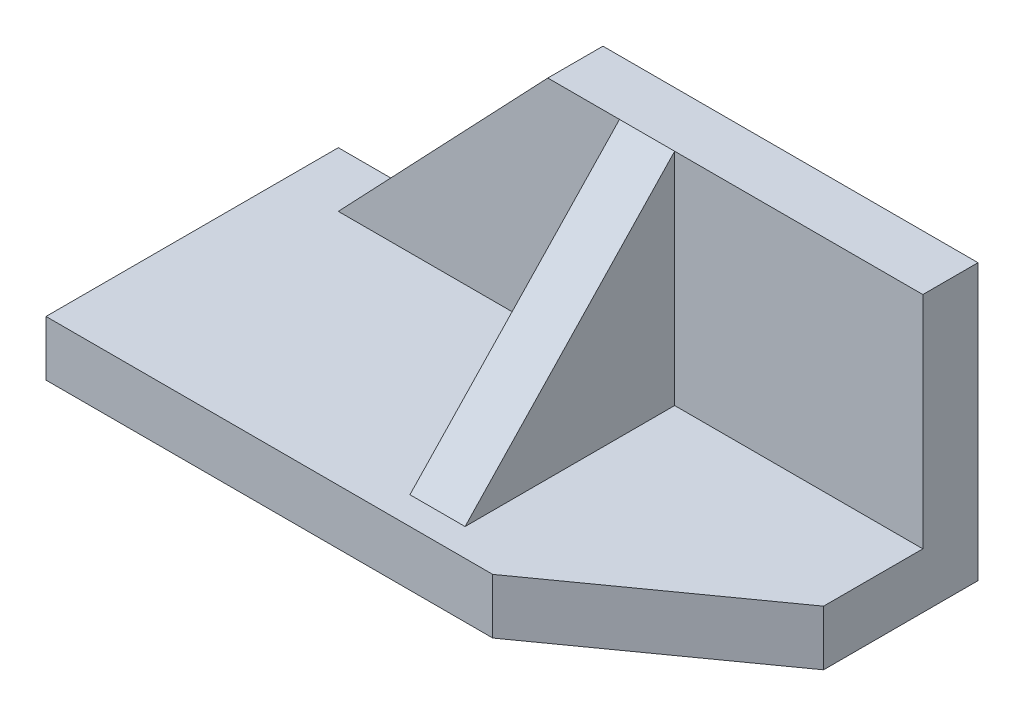
ISO-10303-21;
HEADER;
FILE_DESCRIPTION(('STEP AP214'),'2;1');
FILE_NAME('part.step','',(''),(''),'','','');
FILE_SCHEMA(('AUTOMOTIVE_DESIGN { 1 0 10303 214 1 1 1 1 }'));
ENDSEC;
DATA;
#1=APPLICATION_CONTEXT('core data for automotive mechanical design processes');
#2=APPLICATION_PROTOCOL_DEFINITION('international standard','automotive_design',2000,#1);
#3=PRODUCT_CONTEXT('',#1,'mechanical');
#4=PRODUCT('Part','Part','',(#3));
#5=PRODUCT_RELATED_PRODUCT_CATEGORY('part','',(#4));
#6=PRODUCT_DEFINITION_FORMATION('','',#4);
#7=PRODUCT_DEFINITION_CONTEXT('part definition',#1,'design');
#8=PRODUCT_DEFINITION('design','',#6,#7);
#9=PRODUCT_DEFINITION_SHAPE('','',#8);
#10=(LENGTH_UNIT() NAMED_UNIT(*) SI_UNIT(.MILLI.,.METRE.));
#11=(NAMED_UNIT(*) PLANE_ANGLE_UNIT() SI_UNIT($,.RADIAN.));
#12=(NAMED_UNIT(*) SI_UNIT($,.STERADIAN.) SOLID_ANGLE_UNIT());
#13=UNCERTAINTY_MEASURE_WITH_UNIT(LENGTH_MEASURE(1.E-05),#10,'distance_accuracy_value','');
#14=(GEOMETRIC_REPRESENTATION_CONTEXT(3) GLOBAL_UNCERTAINTY_ASSIGNED_CONTEXT((#13)) GLOBAL_UNIT_ASSIGNED_CONTEXT((#10,
#11,#12)) REPRESENTATION_CONTEXT('',''));
#15=CARTESIAN_POINT('',(0.,0.,0.));
#16=DIRECTION('',(0.,0.,1.));
#17=DIRECTION('',(1.,0.,0.));
#18=AXIS2_PLACEMENT_3D('',#15,#16,#17);
#19=CARTESIAN_POINT('',(0.,0.,-43.));
#20=DIRECTION('',(0.,0.,1.));
#21=DIRECTION('',(1.,0.,0.));
#22=AXIS2_PLACEMENT_3D('',#19,#20,#21);
#23=PLANE('',#22);
#24=DIRECTION('',(1.,0.,0.));
#25=VECTOR('',#24,1.);
#26=CARTESIAN_POINT('',(77.4229041916167,39.9322682432194,-43.));
#27=LINE('',#26,#25);
#28=CARTESIAN_POINT('',(32.4229041916167,39.9322682432194,-43.));
#29=VERTEX_POINT('',#28);
#30=CARTESIAN_POINT('',(77.4229041916167,39.9322682432194,-43.));
#31=VERTEX_POINT('',#30);
#32=EDGE_CURVE('E156',#29,#31,#27,.T.);
#33=ORIENTED_EDGE('',*,*,#32,.F.);
#34=DIRECTION('',(0.,1.,0.));
#35=VECTOR('',#34,1.);
#36=CARTESIAN_POINT('',(32.4229041916167,0.,-43.));
#37=LINE('',#36,#35);
#38=CARTESIAN_POINT('',(32.4229041916167,0.,-43.));
#39=VERTEX_POINT('',#38);
#40=EDGE_CURVE('E228',#39,#29,#37,.T.);
#41=ORIENTED_EDGE('',*,*,#40,.F.);
#42=DIRECTION('',(-1.,0.,0.));
#43=VECTOR('',#42,1.);
#44=CARTESIAN_POINT('',(-28.559880239521,0.,-43.));
#45=LINE('',#44,#43);
#46=CARTESIAN_POINT('',(77.4229041916167,0.,-43.));
#47=VERTEX_POINT('',#46);
#48=EDGE_CURVE('E222',#47,#39,#45,.T.);
#49=ORIENTED_EDGE('',*,*,#48,.F.);
#50=DIRECTION('',(0.,-1.,0.));
#51=VECTOR('',#50,1.);
#52=CARTESIAN_POINT('',(77.4229041916167,0.,-43.));
#53=LINE('',#52,#51);
#54=EDGE_CURVE('E155',#31,#47,#53,.T.);
#55=ORIENTED_EDGE('',*,*,#54,.F.);
#56=EDGE_LOOP('',(#33,#41,#49,#55));
#57=FACE_BOUND('',#56,.T.);
#58=ADVANCED_FACE('F39',(#57),#23,.T.);
#59=CARTESIAN_POINT('',(0.,0.,0.));
#60=DIRECTION('',(0.,1.,0.));
#61=DIRECTION('',(0.,0.,1.));
#62=AXIS2_PLACEMENT_3D('',#59,#60,#61);
#63=PLANE('',#62);
#64=DIRECTION('',(0.,0.,-1.));
#65=VECTOR('',#64,1.);
#66=CARTESIAN_POINT('',(22.4229041916167,0.,-5.));
#67=LINE('',#66,#65);
#68=CARTESIAN_POINT('',(22.4229041916167,0.,-5.));
#69=VERTEX_POINT('',#68);
#70=CARTESIAN_POINT('',(22.4229041916167,0.,-43.));
#71=VERTEX_POINT('',#70);
#72=EDGE_CURVE('E134',#69,#71,#67,.T.);
#73=ORIENTED_EDGE('',*,*,#72,.T.);
#74=CARTESIAN_POINT('',(-28.559880239521,0.,-43.));
#75=VERTEX_POINT('',#74);
#76=EDGE_CURVE('E150',#71,#75,#45,.T.);
#77=ORIENTED_EDGE('',*,*,#76,.T.);
#78=DIRECTION('',(0.,0.,-1.));
#79=VECTOR('',#78,1.);
#80=CARTESIAN_POINT('',(-28.559880239521,0.,-43.));
#81=LINE('',#80,#79);
#82=CARTESIAN_POINT('',(-28.559880239521,0.,-53.));
#83=VERTEX_POINT('',#82);
#84=EDGE_CURVE('E159',#75,#83,#81,.T.);
#85=ORIENTED_EDGE('',*,*,#84,.T.);
#86=DIRECTION('',(-1.,0.,0.));
#87=VECTOR('',#86,1.);
#88=CARTESIAN_POINT('',(0.,0.,-53.));
#89=LINE('',#88,#87);
#90=CARTESIAN_POINT('',(-38.559880239521,0.,-53.));
#91=VERTEX_POINT('',#90);
#92=EDGE_CURVE('E192',#83,#91,#89,.T.);
#93=ORIENTED_EDGE('',*,*,#92,.T.);
#94=DIRECTION('',(0.,0.,-1.));
#95=VECTOR('',#94,1.);
#96=CARTESIAN_POINT('',(-38.559880239521,0.,0.));
#97=LINE('',#96,#95);
#98=CARTESIAN_POINT('',(-38.559880239521,0.,0.));
#99=VERTEX_POINT('',#98);
#100=EDGE_CURVE('E194',#99,#91,#97,.T.);
#101=ORIENTED_EDGE('',*,*,#100,.F.);
#102=DIRECTION('',(1.,0.,0.));
#103=VECTOR('',#102,1.);
#104=CARTESIAN_POINT('',(0.,0.,0.));
#105=LINE('',#104,#103);
#106=CARTESIAN_POINT('',(42.440119760479,0.,0.));
#107=VERTEX_POINT('',#106);
#108=EDGE_CURVE('E197',#99,#107,#105,.T.);
#109=ORIENTED_EDGE('',*,*,#108,.T.);
#110=DIRECTION('',(0.81359818422563,0.,-0.58142754890421));
#111=VECTOR('',#110,1.);
#112=CARTESIAN_POINT('',(14.3472217778621,0.,20.0762306656269));
#113=LINE('',#112,#111);
#114=CARTESIAN_POINT('',(77.4229041916167,0.,-25.));
#115=VERTEX_POINT('',#114);
#116=EDGE_CURVE('E179',#107,#115,#113,.T.);
#117=ORIENTED_EDGE('',*,*,#116,.T.);
#118=DIRECTION('',(0.,0.,-1.));
#119=VECTOR('',#118,1.);
#120=CARTESIAN_POINT('',(77.4229041916167,0.,0.));
#121=LINE('',#120,#119);
#122=EDGE_CURVE('E172',#115,#47,#121,.T.);
#123=ORIENTED_EDGE('',*,*,#122,.T.);
#124=ORIENTED_EDGE('',*,*,#48,.T.);
#125=DIRECTION('',(0.,0.,-1.));
#126=VECTOR('',#125,1.);
#127=CARTESIAN_POINT('',(32.4229041916167,0.,-5.));
#128=LINE('',#127,#126);
#129=CARTESIAN_POINT('',(32.4229041916167,0.,-5.));
#130=VERTEX_POINT('',#129);
#131=EDGE_CURVE('E56',#130,#39,#128,.T.);
#132=ORIENTED_EDGE('',*,*,#131,.F.);
#133=DIRECTION('',(1.,0.,0.));
#134=VECTOR('',#133,1.);
#135=CARTESIAN_POINT('',(22.4229041916167,0.,-5.));
#136=LINE('',#135,#134);
#137=EDGE_CURVE('E133',#69,#130,#136,.T.);
#138=ORIENTED_EDGE('',*,*,#137,.F.);
#139=EDGE_LOOP('',(#73,#77,#85,#93,#101,#109,#117,#123,#124,#132,#138));
#140=FACE_BOUND('',#139,.T.);
#141=ADVANCED_FACE('F219',(#140),#63,.T.);
#142=CARTESIAN_POINT('',(77.4229041916167,-10.,0.));
#143=DIRECTION('',(1.,0.,0.));
#144=DIRECTION('',(0.,0.,-1.));
#145=AXIS2_PLACEMENT_3D('',#142,#143,#144);
#146=PLANE('',#145);
#147=ORIENTED_EDGE('',*,*,#122,.F.);
#148=DIRECTION('',(0.,1.,0.));
#149=VECTOR('',#148,1.);
#150=CARTESIAN_POINT('',(77.4229041916167,-10.,-25.));
#151=LINE('',#150,#149);
#152=CARTESIAN_POINT('',(77.4229041916167,-10.,-25.));
#153=VERTEX_POINT('',#152);
#154=EDGE_CURVE('E11',#153,#115,#151,.T.);
#155=ORIENTED_EDGE('',*,*,#154,.F.);
#156=DIRECTION('',(0.,0.,-1.));
#157=VECTOR('',#156,1.);
#158=CARTESIAN_POINT('',(77.4229041916167,-10.,0.));
#159=LINE('',#158,#157);
#160=CARTESIAN_POINT('',(77.4229041916167,-10.,-53.));
#161=VERTEX_POINT('',#160);
#162=EDGE_CURVE('E175',#153,#161,#159,.T.);
#163=ORIENTED_EDGE('',*,*,#162,.T.);
#164=DIRECTION('',(0.,1.,0.));
#165=VECTOR('',#164,1.);
#166=CARTESIAN_POINT('',(77.4229041916167,-10.,-53.));
#167=LINE('',#166,#165);
#168=CARTESIAN_POINT('',(77.4229041916167,39.9322682432194,-53.));
#169=VERTEX_POINT('',#168);
#170=EDGE_CURVE('E43',#161,#169,#167,.T.);
#171=ORIENTED_EDGE('',*,*,#170,.T.);
#172=DIRECTION('',(0.,0.,-1.));
#173=VECTOR('',#172,1.);
#174=CARTESIAN_POINT('',(77.4229041916167,39.9322682432194,-43.));
#175=LINE('',#174,#173);
#176=EDGE_CURVE('E169',#31,#169,#175,.T.);
#177=ORIENTED_EDGE('',*,*,#176,.F.);
#178=ORIENTED_EDGE('',*,*,#54,.T.);
#179=EDGE_LOOP('',(#147,#155,#163,#171,#177,#178));
#180=FACE_BOUND('',#179,.T.);
#181=ADVANCED_FACE('F41',(#180),#146,.T.);
#182=CARTESIAN_POINT('',(14.3472217778621,-10.,20.0762306656269));
#183=DIRECTION('',(0.58142754890421,0.,0.81359818422563));
#184=DIRECTION('',(0.81359818422563,0.,-0.58142754890421));
#185=AXIS2_PLACEMENT_3D('',#182,#183,#184);
#186=PLANE('',#185);
#187=ORIENTED_EDGE('',*,*,#116,.F.);
#188=DIRECTION('',(0.,1.,0.));
#189=VECTOR('',#188,1.);
#190=CARTESIAN_POINT('',(42.440119760479,-10.,0.));
#191=LINE('',#190,#189);
#192=CARTESIAN_POINT('',(42.440119760479,-10.,0.));
#193=VERTEX_POINT('',#192);
#194=EDGE_CURVE('E48',#193,#107,#191,.T.);
#195=ORIENTED_EDGE('',*,*,#194,.F.);
#196=DIRECTION('',(0.81359818422563,0.,-0.58142754890421));
#197=VECTOR('',#196,1.);
#198=CARTESIAN_POINT('',(14.3472217778621,-10.,20.0762306656269));
#199=LINE('',#198,#197);
#200=EDGE_CURVE('E187',#193,#153,#199,.T.);
#201=ORIENTED_EDGE('',*,*,#200,.T.);
#202=ORIENTED_EDGE('',*,*,#154,.T.);
#203=EDGE_LOOP('',(#187,#195,#201,#202));
#204=FACE_BOUND('',#203,.T.);
#205=ADVANCED_FACE('F234',(#204),#186,.T.);
#206=CARTESIAN_POINT('',(0.,-10.,0.));
#207=DIRECTION('',(0.,0.,1.));
#208=DIRECTION('',(1.,0.,0.));
#209=AXIS2_PLACEMENT_3D('',#206,#207,#208);
#210=PLANE('',#209);
#211=ORIENTED_EDGE('',*,*,#108,.F.);
#212=DIRECTION('',(0.,1.,0.));
#213=VECTOR('',#212,1.);
#214=CARTESIAN_POINT('',(-38.559880239521,-10.,0.));
#215=LINE('',#214,#213);
#216=CARTESIAN_POINT('',(-38.559880239521,-10.,0.));
#217=VERTEX_POINT('',#216);
#218=EDGE_CURVE('E203',#217,#99,#215,.T.);
#219=ORIENTED_EDGE('',*,*,#218,.F.);
#220=DIRECTION('',(1.,0.,0.));
#221=VECTOR('',#220,1.);
#222=CARTESIAN_POINT('',(0.,-10.,0.));
#223=LINE('',#222,#221);
#224=EDGE_CURVE('E184',#217,#193,#223,.T.);
#225=ORIENTED_EDGE('',*,*,#224,.T.);
#226=ORIENTED_EDGE('',*,*,#194,.T.);
#227=EDGE_LOOP('',(#211,#219,#225,#226));
#228=FACE_BOUND('',#227,.T.);
#229=ADVANCED_FACE('F243',(#228),#210,.T.);
#230=CARTESIAN_POINT('',(-38.559880239521,-10.,0.));
#231=DIRECTION('',(1.,0.,0.));
#232=DIRECTION('',(0.,0.,-1.));
#233=AXIS2_PLACEMENT_3D('',#230,#231,#232);
#234=PLANE('',#233);
#235=ORIENTED_EDGE('',*,*,#100,.T.);
#236=DIRECTION('',(0.,1.,0.));
#237=VECTOR('',#236,1.);
#238=CARTESIAN_POINT('',(-38.559880239521,-10.,-53.));
#239=LINE('',#238,#237);
#240=CARTESIAN_POINT('',(-38.559880239521,-10.,-53.));
#241=VERTEX_POINT('',#240);
#242=EDGE_CURVE('E204',#241,#91,#239,.T.);
#243=ORIENTED_EDGE('',*,*,#242,.F.);
#244=DIRECTION('',(0.,0.,-1.));
#245=VECTOR('',#244,1.);
#246=CARTESIAN_POINT('',(-38.559880239521,-10.,0.));
#247=LINE('',#246,#245);
#248=EDGE_CURVE('E182',#217,#241,#247,.T.);
#249=ORIENTED_EDGE('',*,*,#248,.F.);
#250=ORIENTED_EDGE('',*,*,#218,.T.);
#251=EDGE_LOOP('',(#235,#243,#249,#250));
#252=FACE_BOUND('',#251,.T.);
#253=ADVANCED_FACE('F241',(#252),#234,.F.);
#254=CARTESIAN_POINT('',(0.,-10.,-53.));
#255=DIRECTION('',(0.,0.,-1.));
#256=DIRECTION('',(-1.,0.,0.));
#257=AXIS2_PLACEMENT_3D('',#254,#255,#256);
#258=PLANE('',#257);
#259=ORIENTED_EDGE('',*,*,#92,.F.);
#260=DIRECTION('',(0.689198826561556,0.724572272079311,0.));
#261=VECTOR('',#260,1.);
#262=CARTESIAN_POINT('',(9.4229041916167,39.9322682432194,-53.));
#263=LINE('',#262,#261);
#264=CARTESIAN_POINT('',(9.4229041916167,39.9322682432194,-53.));
#265=VERTEX_POINT('',#264);
#266=EDGE_CURVE('E64',#83,#265,#263,.T.);
#267=ORIENTED_EDGE('',*,*,#266,.T.);
#268=DIRECTION('',(1.,0.,0.));
#269=VECTOR('',#268,1.);
#270=CARTESIAN_POINT('',(77.4229041916167,39.9322682432194,-53.));
#271=LINE('',#270,#269);
#272=EDGE_CURVE('E166',#265,#169,#271,.T.);
#273=ORIENTED_EDGE('',*,*,#272,.T.);
#274=ORIENTED_EDGE('',*,*,#170,.F.);
#275=DIRECTION('',(-1.,0.,0.));
#276=VECTOR('',#275,1.);
#277=CARTESIAN_POINT('',(0.,-10.,-53.));
#278=LINE('',#277,#276);
#279=EDGE_CURVE('E178',#161,#241,#278,.T.);
#280=ORIENTED_EDGE('',*,*,#279,.T.);
#281=ORIENTED_EDGE('',*,*,#242,.T.);
#282=EDGE_LOOP('',(#259,#267,#273,#274,#280,#281));
#283=FACE_BOUND('',#282,.T.);
#284=ADVANCED_FACE('F216',(#283),#258,.T.);
#285=CARTESIAN_POINT('',(0.,-10.,0.));
#286=DIRECTION('',(0.,1.,0.));
#287=DIRECTION('',(0.,0.,1.));
#288=AXIS2_PLACEMENT_3D('',#285,#286,#287);
#289=PLANE('',#288);
#290=ORIENTED_EDGE('',*,*,#162,.F.);
#291=ORIENTED_EDGE('',*,*,#200,.F.);
#292=ORIENTED_EDGE('',*,*,#224,.F.);
#293=ORIENTED_EDGE('',*,*,#248,.T.);
#294=ORIENTED_EDGE('',*,*,#279,.F.);
#295=EDGE_LOOP('',(#290,#291,#292,#293,#294));
#296=FACE_BOUND('',#295,.T.);
#297=ADVANCED_FACE('F237',(#296),#289,.F.);
#298=CARTESIAN_POINT('',(77.4229041916167,39.9322682432194,-43.));
#299=DIRECTION('',(0.,1.,0.));
#300=DIRECTION('',(0.,0.,1.));
#301=AXIS2_PLACEMENT_3D('',#298,#299,#300);
#302=PLANE('',#301);
#303=ORIENTED_EDGE('',*,*,#272,.F.);
#304=DIRECTION('',(0.,0.,-1.));
#305=VECTOR('',#304,1.);
#306=CARTESIAN_POINT('',(9.4229041916167,39.9322682432194,-43.));
#307=LINE('',#306,#305);
#308=CARTESIAN_POINT('',(9.4229041916167,39.9322682432194,-43.));
#309=VERTEX_POINT('',#308);
#310=EDGE_CURVE('E154',#309,#265,#307,.T.);
#311=ORIENTED_EDGE('',*,*,#310,.F.);
#312=CARTESIAN_POINT('',(22.4229041916167,39.9322682432194,-43.));
#313=VERTEX_POINT('',#312);
#314=EDGE_CURVE('E148',#309,#313,#27,.T.);
#315=ORIENTED_EDGE('',*,*,#314,.T.);
#316=DIRECTION('',(1.,0.,0.));
#317=VECTOR('',#316,1.);
#318=CARTESIAN_POINT('',(22.4229041916167,39.9322682432194,-43.));
#319=LINE('',#318,#317);
#320=EDGE_CURVE('E125',#313,#29,#319,.T.);
#321=ORIENTED_EDGE('',*,*,#320,.T.);
#322=ORIENTED_EDGE('',*,*,#32,.T.);
#323=ORIENTED_EDGE('',*,*,#176,.T.);
#324=EDGE_LOOP('',(#303,#311,#315,#321,#322,#323));
#325=FACE_BOUND('',#324,.T.);
#326=ADVANCED_FACE('F153',(#325),#302,.T.);
#327=CARTESIAN_POINT('',(9.4229041916167,39.9322682432194,-43.));
#328=DIRECTION('',(-0.724572272079311,0.689198826561556,0.));
#329=DIRECTION('',(-0.689198826561556,-0.724572272079311,0.));
#330=AXIS2_PLACEMENT_3D('',#327,#328,#329);
#331=PLANE('',#330);
#332=ORIENTED_EDGE('',*,*,#266,.F.);
#333=ORIENTED_EDGE('',*,*,#84,.F.);
#334=DIRECTION('',(0.689198826561556,0.724572272079311,0.));
#335=VECTOR('',#334,1.);
#336=CARTESIAN_POINT('',(9.4229041916167,39.9322682432194,-43.));
#337=LINE('',#336,#335);
#338=EDGE_CURVE('E161',#75,#309,#337,.T.);
#339=ORIENTED_EDGE('',*,*,#338,.T.);
#340=ORIENTED_EDGE('',*,*,#310,.T.);
#341=EDGE_LOOP('',(#332,#333,#339,#340));
#342=FACE_BOUND('',#341,.T.);
#343=ADVANCED_FACE('F221',(#342),#331,.T.);
#344=DIRECTION('',(0.,1.,0.));
#345=VECTOR('',#344,1.);
#346=CARTESIAN_POINT('',(22.4229041916167,0.,-43.));
#347=LINE('',#346,#345);
#348=EDGE_CURVE('E139',#71,#313,#347,.T.);
#349=ORIENTED_EDGE('',*,*,#348,.T.);
#350=ORIENTED_EDGE('',*,*,#314,.F.);
#351=ORIENTED_EDGE('',*,*,#338,.F.);
#352=ORIENTED_EDGE('',*,*,#76,.F.);
#353=EDGE_LOOP('',(#349,#350,#351,#352));
#354=FACE_BOUND('',#353,.T.);
#355=ADVANCED_FACE('F146',(#354),#23,.T.);
#356=CARTESIAN_POINT('',(22.4229041916167,39.9322682432194,-43.));
#357=DIRECTION('',(0.,0.689362773113452,0.724416294022526));
#358=DIRECTION('',(0.,-0.724416294022526,0.689362773113452));
#359=AXIS2_PLACEMENT_3D('',#356,#357,#358);
#360=PLANE('',#359);
#361=DIRECTION('',(0.,-0.724416294022526,0.689362773113452));
#362=VECTOR('',#361,1.);
#363=CARTESIAN_POINT('',(32.4229041916167,39.9322682432194,-43.));
#364=LINE('',#363,#362);
#365=EDGE_CURVE('E130',#29,#130,#364,.T.);
#366=ORIENTED_EDGE('',*,*,#365,.F.);
#367=ORIENTED_EDGE('',*,*,#320,.F.);
#368=DIRECTION('',(0.,-0.724416294022526,0.689362773113452));
#369=VECTOR('',#368,1.);
#370=CARTESIAN_POINT('',(22.4229041916167,39.9322682432194,-43.));
#371=LINE('',#370,#369);
#372=EDGE_CURVE('E128',#313,#69,#371,.T.);
#373=ORIENTED_EDGE('',*,*,#372,.T.);
#374=ORIENTED_EDGE('',*,*,#137,.T.);
#375=EDGE_LOOP('',(#366,#367,#373,#374));
#376=FACE_BOUND('',#375,.T.);
#377=ADVANCED_FACE('F127',(#376),#360,.T.);
#378=CARTESIAN_POINT('',(22.4229041916167,0.,0.));
#379=DIRECTION('',(-1.,0.,0.));
#380=DIRECTION('',(0.,0.,1.));
#381=AXIS2_PLACEMENT_3D('',#378,#379,#380);
#382=PLANE('',#381);
#383=ORIENTED_EDGE('',*,*,#348,.F.);
#384=ORIENTED_EDGE('',*,*,#72,.F.);
#385=ORIENTED_EDGE('',*,*,#372,.F.);
#386=EDGE_LOOP('',(#383,#384,#385));
#387=FACE_BOUND('',#386,.T.);
#388=ADVANCED_FACE('F138',(#387),#382,.T.);
#389=CARTESIAN_POINT('',(32.4229041916167,0.,0.));
#390=DIRECTION('',(-1.,0.,0.));
#391=DIRECTION('',(0.,0.,1.));
#392=AXIS2_PLACEMENT_3D('',#389,#390,#391);
#393=PLANE('',#392);
#394=ORIENTED_EDGE('',*,*,#40,.T.);
#395=ORIENTED_EDGE('',*,*,#365,.T.);
#396=ORIENTED_EDGE('',*,*,#131,.T.);
#397=EDGE_LOOP('',(#394,#395,#396));
#398=FACE_BOUND('',#397,.T.);
#399=ADVANCED_FACE('F230',(#398),#393,.F.);
#400=CLOSED_SHELL('',(#58,#141,#181,#205,#229,#253,#284,#297,#326,#343,#355,#377,#388,#399));
#401=MANIFOLD_SOLID_BREP('B2',#400);
#402=ADVANCED_BREP_SHAPE_REPRESENTATION('',(#18,#401),#14);
#403=SHAPE_DEFINITION_REPRESENTATION(#9,#402);
ENDSEC;
END-ISO-10303-21;
